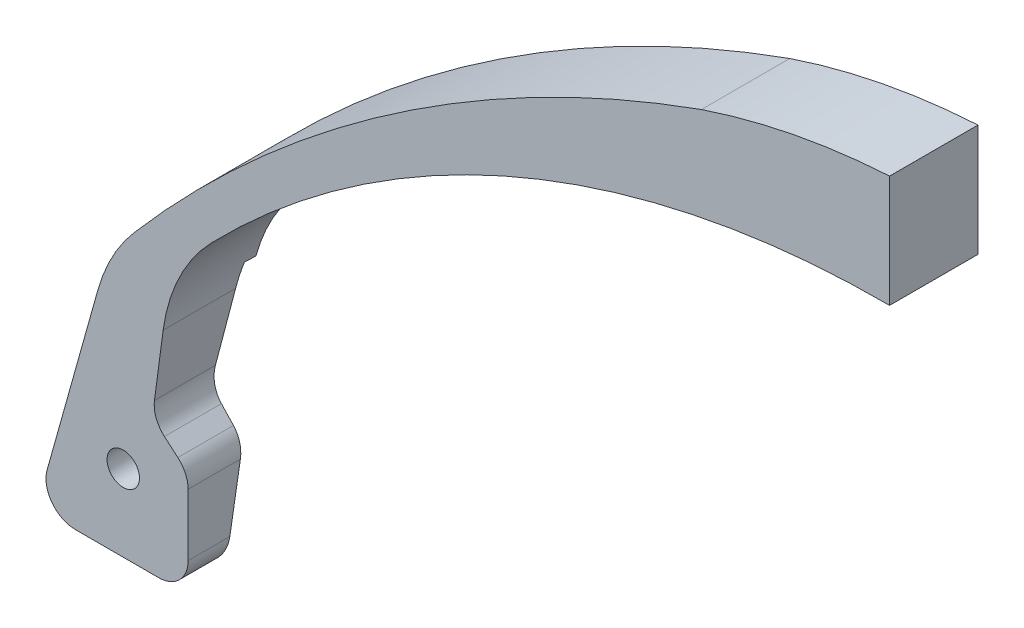
ISO-10303-21;
HEADER;
FILE_DESCRIPTION(('STEP AP214'),'2;1');
FILE_NAME('part.step','',(''),(''),'','','');
FILE_SCHEMA(('AUTOMOTIVE_DESIGN { 1 0 10303 214 1 1 1 1 }'));
ENDSEC;
DATA;
#1=APPLICATION_CONTEXT('core data for automotive mechanical design processes');
#2=APPLICATION_PROTOCOL_DEFINITION('international standard','automotive_design',2000,#1);
#3=PRODUCT_CONTEXT('',#1,'mechanical');
#4=PRODUCT('Part','Part','',(#3));
#5=PRODUCT_RELATED_PRODUCT_CATEGORY('part','',(#4));
#6=PRODUCT_DEFINITION_FORMATION('','',#4);
#7=PRODUCT_DEFINITION_CONTEXT('part definition',#1,'design');
#8=PRODUCT_DEFINITION('design','',#6,#7);
#9=PRODUCT_DEFINITION_SHAPE('','',#8);
#10=(LENGTH_UNIT() NAMED_UNIT(*) SI_UNIT(.MILLI.,.METRE.));
#11=(NAMED_UNIT(*) PLANE_ANGLE_UNIT() SI_UNIT($,.RADIAN.));
#12=(NAMED_UNIT(*) SI_UNIT($,.STERADIAN.) SOLID_ANGLE_UNIT());
#13=UNCERTAINTY_MEASURE_WITH_UNIT(LENGTH_MEASURE(1.E-05),#10,'distance_accuracy_value','');
#14=(GEOMETRIC_REPRESENTATION_CONTEXT(3) GLOBAL_UNCERTAINTY_ASSIGNED_CONTEXT((#13)) GLOBAL_UNIT_ASSIGNED_CONTEXT((#10,
#11,#12)) REPRESENTATION_CONTEXT('',''));
#15=CARTESIAN_POINT('',(0.,0.,0.));
#16=DIRECTION('',(0.,0.,1.));
#17=DIRECTION('',(1.,0.,0.));
#18=AXIS2_PLACEMENT_3D('',#15,#16,#17);
#19=CARTESIAN_POINT('',(-0.845059629265218,-70.0518343791008,15.));
#20=DIRECTION('',(0.,0.,1.));
#21=DIRECTION('',(1.,0.,0.));
#22=AXIS2_PLACEMENT_3D('',#19,#20,#21);
#23=PLANE('',#22);
#24=DIRECTION('',(-0.269681778757233,-0.962949499302188,0.));
#25=VECTOR('',#24,1.);
#26=CARTESIAN_POINT('',(-144.7,-13.,15.));
#27=LINE('',#26,#25);
#28=CARTESIAN_POINT('',(-134.294355961507,24.1553086120934,15.));
#29=VERTEX_POINT('',#28);
#30=CARTESIAN_POINT('',(-142.922076854503,-6.65159110621383,15.));
#31=VERTEX_POINT('',#30);
#32=EDGE_CURVE('E274',#29,#31,#27,.T.);
#33=ORIENTED_EDGE('',*,*,#32,.T.);
#34=CARTESIAN_POINT('',(-138.107329357992,-8.,15.));
#35=DIRECTION('',(0.,0.,1.));
#36=DIRECTION('',(1.,0.,0.));
#37=AXIS2_PLACEMENT_3D('',#34,#35,#36);
#38=CIRCLE('',#37,5.);
#39=CARTESIAN_POINT('',(-138.107329357992,-13.,15.));
#40=VERTEX_POINT('',#39);
#41=EDGE_CURVE('E11',#31,#40,#38,.T.);
#42=ORIENTED_EDGE('',*,*,#41,.T.);
#43=DIRECTION('',(1.,0.,0.));
#44=VECTOR('',#43,1.);
#45=CARTESIAN_POINT('',(-119.,-13.,15.));
#46=LINE('',#45,#44);
#47=CARTESIAN_POINT('',(-124.,-13.,15.));
#48=VERTEX_POINT('',#47);
#49=EDGE_CURVE('E255',#40,#48,#46,.T.);
#50=ORIENTED_EDGE('',*,*,#49,.T.);
#51=CARTESIAN_POINT('',(-124.,-8.,15.));
#52=DIRECTION('',(0.,0.,1.));
#53=DIRECTION('',(1.,0.,0.));
#54=AXIS2_PLACEMENT_3D('',#51,#52,#53);
#55=CIRCLE('',#54,5.);
#56=CARTESIAN_POINT('',(-119.,-8.,15.));
#57=VERTEX_POINT('',#56);
#58=EDGE_CURVE('E245',#48,#57,#55,.T.);
#59=ORIENTED_EDGE('',*,*,#58,.T.);
#60=DIRECTION('',(0.,1.,0.));
#61=VECTOR('',#60,1.);
#62=CARTESIAN_POINT('',(-119.,4.78233543889837,15.));
#63=LINE('',#62,#61);
#64=CARTESIAN_POINT('',(-119.,2.48831446117919,15.));
#65=VERTEX_POINT('',#64);
#66=EDGE_CURVE('E277',#57,#65,#63,.T.);
#67=ORIENTED_EDGE('',*,*,#66,.T.);
#68=CARTESIAN_POINT('',(-124.,2.48831446117919,15.));
#69=DIRECTION('',(0.,0.,1.));
#70=DIRECTION('',(1.,0.,0.));
#71=AXIS2_PLACEMENT_3D('',#68,#69,#70);
#72=CIRCLE('',#71,5.);
#73=CARTESIAN_POINT('',(-120.738959649311,6.278514433632,15.));
#74=VERTEX_POINT('',#73);
#75=EDGE_CURVE('E234',#65,#74,#72,.T.);
#76=ORIENTED_EDGE('',*,*,#75,.T.);
#77=DIRECTION('',(-0.758039994490562,0.652208070137704,0.));
#78=VECTOR('',#77,1.);
#79=CARTESIAN_POINT('',(-125.064319955924,10.,15.));
#80=LINE('',#79,#78);
#81=CARTESIAN_POINT('',(-123.011519403249,8.23379624219226,15.));
#82=VERTEX_POINT('',#81);
#83=EDGE_CURVE('E279',#74,#82,#80,.T.);
#84=ORIENTED_EDGE('',*,*,#83,.T.);
#85=CARTESIAN_POINT('',(-119.750479052561,12.0239962146451,15.));
#86=DIRECTION('',(0.,0.,1.));
#87=DIRECTION('',(1.,0.,0.));
#88=AXIS2_PLACEMENT_3D('',#85,#86,#87);
#89=CIRCLE('',#88,5.);
#90=CARTESIAN_POINT('',(-124.706684778162,12.6843179585853,15.));
#91=VERTEX_POINT('',#90);
#92=EDGE_CURVE('E223',#82,#91,#89,.F.);
#93=ORIENTED_EDGE('',*,*,#92,.T.);
#94=DIRECTION('',(0.132064348788054,0.991241145120191,0.));
#95=VECTOR('',#94,1.);
#96=CARTESIAN_POINT('',(-125.064319955924,10.,15.));
#97=LINE('',#96,#95);
#98=CARTESIAN_POINT('',(-123.232641548798,23.7481085427997,15.));
#99=VERTEX_POINT('',#98);
#100=EDGE_CURVE('E281',#91,#99,#97,.T.);
#101=ORIENTED_EDGE('',*,*,#100,.T.);
#102=CARTESIAN_POINT('',(-93.4954071951919,19.7861780791581,15.));
#103=DIRECTION('',(0.,0.,1.));
#104=DIRECTION('',(1.,0.,0.));
#105=AXIS2_PLACEMENT_3D('',#102,#103,#104);
#106=CIRCLE('',#105,30.);
#107=CARTESIAN_POINT('',(-115.032970686714,40.6699842180943,15.));
#108=VERTEX_POINT('',#107);
#109=EDGE_CURVE('E156',#99,#108,#106,.F.);
#110=ORIENTED_EDGE('',*,*,#109,.T.);
#111=CARTESIAN_POINT('',(-0.845059629265218,-70.0518343791008,15.));
#112=DIRECTION('',(0.,0.,-1.));
#113=DIRECTION('',(1.,0.,0.));
#114=AXIS2_PLACEMENT_3D('',#111,#112,#113);
#115=CIRCLE('',#114,159.054079309944);
#116=CARTESIAN_POINT('',(0.,89.,15.));
#117=VERTEX_POINT('',#116);
#118=EDGE_CURVE('E150',#108,#117,#115,.T.);
#119=ORIENTED_EDGE('',*,*,#118,.T.);
#120=DIRECTION('',(0.,1.,0.));
#121=VECTOR('',#120,1.);
#122=CARTESIAN_POINT('',(0.,108.,15.));
#123=LINE('',#122,#121);
#124=CARTESIAN_POINT('',(0.,108.,15.));
#125=VERTEX_POINT('',#124);
#126=EDGE_CURVE('E153',#117,#125,#123,.T.);
#127=ORIENTED_EDGE('',*,*,#126,.T.);
#128=CARTESIAN_POINT('',(7.06303295185343,-13.972703231893,15.));
#129=DIRECTION('',(0.,0.,1.));
#130=DIRECTION('',(-1.,0.,0.));
#131=AXIS2_PLACEMENT_3D('',#128,#129,#130);
#132=CIRCLE('',#131,122.177030444247);
#133=CARTESIAN_POINT('',(-31.918403877679,101.818809198335,15.));
#134=VERTEX_POINT('',#133);
#135=EDGE_CURVE('E170',#125,#134,#132,.T.);
#136=ORIENTED_EDGE('',*,*,#135,.T.);
#137=CARTESIAN_POINT('',(45.2497227622976,-113.42010972918,15.));
#138=DIRECTION('',(0.,0.,1.));
#139=DIRECTION('',(1.,0.,0.));
#140=AXIS2_PLACEMENT_3D('',#137,#138,#139);
#141=CIRCLE('',#140,228.65413180218);
#142=CARTESIAN_POINT('',(-128.157312250438,35.6191877674885,15.));
#143=VERTEX_POINT('',#142);
#144=EDGE_CURVE('E271',#134,#143,#141,.T.);
#145=ORIENTED_EDGE('',*,*,#144,.T.);
#146=CARTESIAN_POINT('',(-105.405870982442,16.0648552493764,15.));
#147=DIRECTION('',(0.,0.,1.));
#148=DIRECTION('',(1.,0.,0.));
#149=AXIS2_PLACEMENT_3D('',#146,#147,#148);
#150=CIRCLE('',#149,30.);
#151=EDGE_CURVE('E197',#143,#29,#150,.T.);
#152=ORIENTED_EDGE('',*,*,#151,.T.);
#153=EDGE_LOOP('',(#33,#42,#50,#59,#67,#76,#84,#93,#101,#110,#119,#127,#136,#145,#152));
#154=FACE_BOUND('',#153,.T.);
#155=CARTESIAN_POINT('',(-130.,0.,15.));
#156=DIRECTION('',(0.,0.,1.));
#157=DIRECTION('',(1.,0.,0.));
#158=AXIS2_PLACEMENT_3D('',#155,#156,#157);
#159=CIRCLE('',#158,2.75000000000001);
#160=CARTESIAN_POINT('',(-127.25,0.,15.));
#161=VERTEX_POINT('',#160);
#162=EDGE_CURVE('E261',#161,#161,#159,.T.);
#163=ORIENTED_EDGE('',*,*,#162,.F.);
#164=EDGE_LOOP('',(#163));
#165=FACE_BOUND('',#164,.T.);
#166=ADVANCED_FACE('F33',(#154,#165),#23,.T.);
#167=CARTESIAN_POINT('',(-0.845059629265218,-70.0518343791008,0.));
#168=DIRECTION('',(0.,0.,1.));
#169=DIRECTION('',(1.,0.,0.));
#170=AXIS2_PLACEMENT_3D('',#167,#168,#169);
#171=PLANE('',#170);
#172=DIRECTION('',(-0.962949499302188,0.269681778757233,0.));
#173=VECTOR('',#172,1.);
#174=CARTESIAN_POINT('',(-97.8981379810458,20.6241834333381,0.));
#175=LINE('',#174,#173);
#176=CARTESIAN_POINT('',(-122.48415135429,27.5096948997757,0.));
#177=VERTEX_POINT('',#176);
#178=CARTESIAN_POINT('',(-131.896112449928,30.1455905637797,0.));
#179=VERTEX_POINT('',#178);
#180=EDGE_CURVE('E188',#177,#179,#175,.T.);
#181=ORIENTED_EDGE('',*,*,#180,.T.);
#182=CARTESIAN_POINT('',(-105.405870982442,16.0648552493764,0.));
#183=DIRECTION('',(0.,0.,1.));
#184=DIRECTION('',(1.,0.,0.));
#185=AXIS2_PLACEMENT_3D('',#182,#183,#184);
#186=CIRCLE('',#185,30.);
#187=CARTESIAN_POINT('',(-128.157312250438,35.6191877674885,0.));
#188=VERTEX_POINT('',#187);
#189=EDGE_CURVE('E193',#179,#188,#186,.F.);
#190=ORIENTED_EDGE('',*,*,#189,.T.);
#191=CARTESIAN_POINT('',(45.2497227622976,-113.42010972918,0.));
#192=DIRECTION('',(0.,0.,1.));
#193=DIRECTION('',(1.,0.,0.));
#194=AXIS2_PLACEMENT_3D('',#191,#192,#193);
#195=CIRCLE('',#194,228.65413180218);
#196=CARTESIAN_POINT('',(-31.918403877679,101.818809198335,0.));
#197=VERTEX_POINT('',#196);
#198=EDGE_CURVE('E161',#197,#188,#195,.T.);
#199=ORIENTED_EDGE('',*,*,#198,.F.);
#200=CARTESIAN_POINT('',(7.06303295185343,-13.972703231893,0.));
#201=DIRECTION('',(0.,0.,1.));
#202=DIRECTION('',(-1.,0.,0.));
#203=AXIS2_PLACEMENT_3D('',#200,#201,#202);
#204=CIRCLE('',#203,122.177030444247);
#205=CARTESIAN_POINT('',(0.,108.,0.));
#206=VERTEX_POINT('',#205);
#207=EDGE_CURVE('E286',#206,#197,#204,.T.);
#208=ORIENTED_EDGE('',*,*,#207,.F.);
#209=DIRECTION('',(0.,1.,0.));
#210=VECTOR('',#209,1.);
#211=CARTESIAN_POINT('',(0.,108.,0.));
#212=LINE('',#211,#210);
#213=CARTESIAN_POINT('',(0.,89.,0.));
#214=VERTEX_POINT('',#213);
#215=EDGE_CURVE('E284',#214,#206,#212,.T.);
#216=ORIENTED_EDGE('',*,*,#215,.F.);
#217=CARTESIAN_POINT('',(-0.845059629265218,-70.0518343791008,0.));
#218=DIRECTION('',(0.,0.,-1.));
#219=DIRECTION('',(1.,0.,0.));
#220=AXIS2_PLACEMENT_3D('',#217,#218,#219);
#221=CIRCLE('',#220,159.054079309944);
#222=CARTESIAN_POINT('',(-115.032970686714,40.6699842180943,0.));
#223=VERTEX_POINT('',#222);
#224=EDGE_CURVE('E174',#223,#214,#221,.T.);
#225=ORIENTED_EDGE('',*,*,#224,.F.);
#226=CARTESIAN_POINT('',(-93.4954071951919,19.7861780791581,0.));
#227=DIRECTION('',(0.,0.,1.));
#228=DIRECTION('',(1.,0.,0.));
#229=AXIS2_PLACEMENT_3D('',#226,#227,#228);
#230=CIRCLE('',#229,30.);
#231=EDGE_CURVE('E204',#223,#177,#230,.T.);
#232=ORIENTED_EDGE('',*,*,#231,.T.);
#233=EDGE_LOOP('',(#181,#190,#199,#208,#216,#225,#232));
#234=FACE_BOUND('',#233,.T.);
#235=ADVANCED_FACE('F300',(#234),#171,.F.);
#236=CARTESIAN_POINT('',(-0.845059629265218,-70.0518343791008,15.));
#237=DIRECTION('',(0.,0.,-1.));
#238=DIRECTION('',(-1.,0.,0.));
#239=AXIS2_PLACEMENT_3D('',#236,#237,#238);
#240=CYLINDRICAL_SURFACE('',#239,159.054079309944);
#241=ORIENTED_EDGE('',*,*,#118,.F.);
#242=DIRECTION('',(0.,0.,-1.));
#243=VECTOR('',#242,1.);
#244=CARTESIAN_POINT('',(-115.032970686714,40.6699842180943,15.));
#245=LINE('',#244,#243);
#246=EDGE_CURVE('E199',#108,#223,#245,.T.);
#247=ORIENTED_EDGE('',*,*,#246,.T.);
#248=ORIENTED_EDGE('',*,*,#224,.T.);
#249=DIRECTION('',(0.,0.,-1.));
#250=VECTOR('',#249,1.);
#251=CARTESIAN_POINT('',(0.,89.,15.));
#252=LINE('',#251,#250);
#253=EDGE_CURVE('E166',#117,#214,#252,.T.);
#254=ORIENTED_EDGE('',*,*,#253,.F.);
#255=EDGE_LOOP('',(#241,#247,#248,#254));
#256=FACE_BOUND('',#255,.T.);
#257=ADVANCED_FACE('F172',(#256),#240,.F.);
#258=CARTESIAN_POINT('',(0.,108.,15.));
#259=DIRECTION('',(-1.,0.,0.));
#260=DIRECTION('',(0.,0.,1.));
#261=AXIS2_PLACEMENT_3D('',#258,#259,#260);
#262=PLANE('',#261);
#263=ORIENTED_EDGE('',*,*,#215,.T.);
#264=DIRECTION('',(0.,0.,-1.));
#265=VECTOR('',#264,1.);
#266=CARTESIAN_POINT('',(0.,108.,15.));
#267=LINE('',#266,#265);
#268=EDGE_CURVE('E168',#125,#206,#267,.T.);
#269=ORIENTED_EDGE('',*,*,#268,.F.);
#270=ORIENTED_EDGE('',*,*,#126,.F.);
#271=ORIENTED_EDGE('',*,*,#253,.T.);
#272=EDGE_LOOP('',(#263,#269,#270,#271));
#273=FACE_BOUND('',#272,.T.);
#274=ADVANCED_FACE('F165',(#273),#262,.F.);
#275=CARTESIAN_POINT('',(7.06303295185343,-13.972703231893,15.));
#276=DIRECTION('',(0.,0.,-1.));
#277=DIRECTION('',(-1.,0.,0.));
#278=AXIS2_PLACEMENT_3D('',#275,#276,#277);
#279=CYLINDRICAL_SURFACE('',#278,122.177030444247);
#280=ORIENTED_EDGE('',*,*,#207,.T.);
#281=DIRECTION('',(0.,0.,-1.));
#282=VECTOR('',#281,1.);
#283=CARTESIAN_POINT('',(-31.918403877679,101.818809198335,15.));
#284=LINE('',#283,#282);
#285=EDGE_CURVE('E181',#134,#197,#284,.T.);
#286=ORIENTED_EDGE('',*,*,#285,.F.);
#287=ORIENTED_EDGE('',*,*,#135,.F.);
#288=ORIENTED_EDGE('',*,*,#268,.T.);
#289=EDGE_LOOP('',(#280,#286,#287,#288));
#290=FACE_BOUND('',#289,.T.);
#291=ADVANCED_FACE('F308',(#290),#279,.T.);
#292=CARTESIAN_POINT('',(45.2497227622976,-113.42010972918,15.));
#293=DIRECTION('',(0.,0.,-1.));
#294=DIRECTION('',(-1.,0.,0.));
#295=AXIS2_PLACEMENT_3D('',#292,#293,#294);
#296=CYLINDRICAL_SURFACE('',#295,228.65413180218);
#297=ORIENTED_EDGE('',*,*,#198,.T.);
#298=DIRECTION('',(0.,0.,-1.));
#299=VECTOR('',#298,1.);
#300=CARTESIAN_POINT('',(-128.157312250438,35.6191877674886,15.));
#301=LINE('',#300,#299);
#302=EDGE_CURVE('E195',#188,#143,#301,.F.);
#303=ORIENTED_EDGE('',*,*,#302,.T.);
#304=ORIENTED_EDGE('',*,*,#144,.F.);
#305=ORIENTED_EDGE('',*,*,#285,.T.);
#306=EDGE_LOOP('',(#297,#303,#304,#305));
#307=FACE_BOUND('',#306,.T.);
#308=ADVANCED_FACE('F294',(#307),#296,.T.);
#309=CARTESIAN_POINT('',(-144.7,-13.,15.));
#310=DIRECTION('',(0.962949499302188,-0.269681778757233,0.));
#311=DIRECTION('',(0.269681778757233,0.962949499302188,0.));
#312=AXIS2_PLACEMENT_3D('',#309,#310,#311);
#313=PLANE('',#312);
#314=DIRECTION('',(0.265540688207384,0.948162956844932,-0.174571332622009));
#315=VECTOR('',#314,1.);
#316=CARTESIAN_POINT('',(-144.7,-13.,10.));
#317=LINE('',#316,#315);
#318=CARTESIAN_POINT('',(-142.922076854503,-6.65159110621381,8.83116062210927));
#319=VERTEX_POINT('',#318);
#320=CARTESIAN_POINT('',(-134.294355961507,24.1553086120934,3.15913821398535));
#321=VERTEX_POINT('',#320);
#322=EDGE_CURVE('E345',#319,#321,#317,.T.);
#323=ORIENTED_EDGE('',*,*,#322,.F.);
#324=DIRECTION('',(0.,0.,-1.));
#325=VECTOR('',#324,1.);
#326=CARTESIAN_POINT('',(-142.922076854503,-6.65159110621383,15.));
#327=LINE('',#326,#325);
#328=EDGE_CURVE('E41',#319,#31,#327,.F.);
#329=ORIENTED_EDGE('',*,*,#328,.T.);
#330=ORIENTED_EDGE('',*,*,#32,.F.);
#331=DIRECTION('',(0.,0.,-1.));
#332=VECTOR('',#331,1.);
#333=CARTESIAN_POINT('',(-134.294355961507,24.1553086120934,15.));
#334=LINE('',#333,#332);
#335=EDGE_CURVE('E176',#29,#321,#334,.T.);
#336=ORIENTED_EDGE('',*,*,#335,.T.);
#337=EDGE_LOOP('',(#323,#329,#330,#336));
#338=FACE_BOUND('',#337,.T.);
#339=ADVANCED_FACE('F315',(#338),#313,.F.);
#340=CARTESIAN_POINT('',(-119.,-13.,15.));
#341=DIRECTION('',(0.,1.,0.));
#342=DIRECTION('',(-1.,0.,0.));
#343=AXIS2_PLACEMENT_3D('',#340,#341,#342);
#344=PLANE('',#343);
#345=ORIENTED_EDGE('',*,*,#49,.F.);
#346=DIRECTION('',(0.,0.,-1.));
#347=VECTOR('',#346,1.);
#348=CARTESIAN_POINT('',(-138.107329357992,-13.,15.));
#349=LINE('',#348,#347);
#350=CARTESIAN_POINT('',(-138.107329357992,-13.,9.68478531748893));
#351=VERTEX_POINT('',#350);
#352=EDGE_CURVE('E247',#40,#351,#349,.T.);
#353=ORIENTED_EDGE('',*,*,#352,.T.);
#354=DIRECTION('',(0.998858919511933,0.,-0.0477583386588517));
#355=VECTOR('',#354,1.);
#356=CARTESIAN_POINT('',(-119.297137286777,-13.,8.7854155410103));
#357=LINE('',#356,#355);
#358=CARTESIAN_POINT('',(-124.,-13.,9.01027303162965));
#359=VERTEX_POINT('',#358);
#360=EDGE_CURVE('E254',#351,#359,#357,.T.);
#361=ORIENTED_EDGE('',*,*,#360,.T.);
#362=DIRECTION('',(0.,0.,-1.));
#363=VECTOR('',#362,1.);
#364=CARTESIAN_POINT('',(-124.,-13.,15.));
#365=LINE('',#364,#363);
#366=EDGE_CURVE('E242',#359,#48,#365,.F.);
#367=ORIENTED_EDGE('',*,*,#366,.T.);
#368=EDGE_LOOP('',(#345,#353,#361,#367));
#369=FACE_BOUND('',#368,.T.);
#370=ADVANCED_FACE('F253',(#369),#344,.F.);
#371=CARTESIAN_POINT('',(-119.,4.78233543889837,15.));
#372=DIRECTION('',(-1.,0.,0.));
#373=DIRECTION('',(0.,0.,1.));
#374=AXIS2_PLACEMENT_3D('',#371,#372,#373);
#375=PLANE('',#374);
#376=ORIENTED_EDGE('',*,*,#66,.F.);
#377=DIRECTION('',(0.,0.,-1.));
#378=VECTOR('',#377,1.);
#379=CARTESIAN_POINT('',(-119.,-8.,15.));
#380=LINE('',#379,#378);
#381=CARTESIAN_POINT('',(-119.,-8.,7.91758385113638));
#382=VERTEX_POINT('',#381);
#383=EDGE_CURVE('E236',#57,#382,#380,.T.);
#384=ORIENTED_EDGE('',*,*,#383,.T.);
#385=DIRECTION('',(0.,0.985737532298671,-0.16828998014655));
#386=VECTOR('',#385,1.);
#387=CARTESIAN_POINT('',(-119.,3.24542006063508,5.99771019640119));
#388=LINE('',#387,#386);
#389=CARTESIAN_POINT('',(-119.,2.48831446117919,6.12696700374234));
#390=VERTEX_POINT('',#389);
#391=EDGE_CURVE('E262',#382,#390,#388,.T.);
#392=ORIENTED_EDGE('',*,*,#391,.T.);
#393=DIRECTION('',(0.,0.,-1.));
#394=VECTOR('',#393,1.);
#395=CARTESIAN_POINT('',(-119.,2.48831446117919,15.));
#396=LINE('',#395,#394);
#397=EDGE_CURVE('E231',#390,#65,#396,.F.);
#398=ORIENTED_EDGE('',*,*,#397,.T.);
#399=EDGE_LOOP('',(#376,#384,#392,#398));
#400=FACE_BOUND('',#399,.T.);
#401=ADVANCED_FACE('F335',(#400),#375,.F.);
#402=CARTESIAN_POINT('',(-125.064319955924,10.,15.));
#403=DIRECTION('',(-0.652208070137704,-0.758039994490562,0.));
#404=DIRECTION('',(0.758039994490562,-0.652208070137704,0.));
#405=AXIS2_PLACEMENT_3D('',#402,#403,#404);
#406=PLANE('',#405);
#407=ORIENTED_EDGE('',*,*,#83,.F.);
#408=DIRECTION('',(0.,0.,-1.));
#409=VECTOR('',#408,1.);
#410=CARTESIAN_POINT('',(-120.738959649311,6.278514433632,15.));
#411=LINE('',#410,#409);
#412=CARTESIAN_POINT('',(-120.738959649311,6.278514433632,5.56303004299894));
#413=VERTEX_POINT('',#412);
#414=EDGE_CURVE('E225',#74,#413,#411,.T.);
#415=ORIENTED_EDGE('',*,*,#414,.T.);
#416=DIRECTION('',(-0.755911086850826,0.650376384800117,-0.0748931697174921));
#417=VECTOR('',#416,1.);
#418=CARTESIAN_POINT('',(-124.505807875409,9.51946323567463,5.18982318255662));
#419=LINE('',#418,#417);
#420=CARTESIAN_POINT('',(-123.011519403249,8.23379624219226,5.33787234084923));
#421=VERTEX_POINT('',#420);
#422=EDGE_CURVE('E266',#413,#421,#419,.T.);
#423=ORIENTED_EDGE('',*,*,#422,.T.);
#424=DIRECTION('',(0.,0.,-1.));
#425=VECTOR('',#424,1.);
#426=CARTESIAN_POINT('',(-123.011519403249,8.23379624219226,15.));
#427=LINE('',#426,#425);
#428=EDGE_CURVE('E217',#421,#82,#427,.F.);
#429=ORIENTED_EDGE('',*,*,#428,.T.);
#430=EDGE_LOOP('',(#407,#415,#423,#429));
#431=FACE_BOUND('',#430,.T.);
#432=ADVANCED_FACE('F331',(#431),#406,.F.);
#433=CARTESIAN_POINT('',(-125.064319955924,10.,15.));
#434=DIRECTION('',(-0.991241145120191,0.132064348788054,0.));
#435=DIRECTION('',(-0.132064348788054,-0.991241145120191,0.));
#436=AXIS2_PLACEMENT_3D('',#433,#434,#435);
#437=PLANE('',#436);
#438=ORIENTED_EDGE('',*,*,#100,.F.);
#439=DIRECTION('',(0.,0.,-1.));
#440=VECTOR('',#439,1.);
#441=CARTESIAN_POINT('',(-124.706684778162,12.6843179585853,5.13448765333506));
#442=LINE('',#441,#440);
#443=CARTESIAN_POINT('',(-124.706684778162,12.6843179585853,4.65910805946909));
#444=VERTEX_POINT('',#443);
#445=EDGE_CURVE('E214',#91,#444,#442,.T.);
#446=ORIENTED_EDGE('',*,*,#445,.T.);
#447=DIRECTION('',(0.130075374667799,0.976312415280016,-0.17290015811194));
#448=VECTOR('',#447,1.);
#449=CARTESIAN_POINT('',(-125.286195849959,8.33465642093615,5.42941186368453));
#450=LINE('',#449,#448);
#451=CARTESIAN_POINT('',(-123.232641548798,23.7481085427997,2.69976480889759));
#452=VERTEX_POINT('',#451);
#453=EDGE_CURVE('E187',#444,#452,#450,.T.);
#454=ORIENTED_EDGE('',*,*,#453,.T.);
#455=DIRECTION('',(0.,0.,1.));
#456=VECTOR('',#455,1.);
#457=CARTESIAN_POINT('',(-123.232641548798,23.7481085427997,15.));
#458=LINE('',#457,#456);
#459=EDGE_CURVE('E201',#452,#99,#458,.T.);
#460=ORIENTED_EDGE('',*,*,#459,.T.);
#461=EDGE_LOOP('',(#438,#446,#454,#460));
#462=FACE_BOUND('',#461,.T.);
#463=ADVANCED_FACE('F328',(#462),#437,.F.);
#464=CARTESIAN_POINT('',(-130.,0.,15.));
#465=DIRECTION('',(0.,0.,-1.));
#466=DIRECTION('',(-1.,0.,0.));
#467=AXIS2_PLACEMENT_3D('',#464,#465,#466);
#468=CYLINDRICAL_SURFACE('',#467,2.75000000000001);
#469=CARTESIAN_POINT('',(-130.,0.,7.07772620577887));
#470=DIRECTION('',(0.0470787075015239,0.168103377340879,0.984644529678897));
#471=DIRECTION('',(0.265540688207384,0.948162956844932,-0.174571332622009));
#472=AXIS2_PLACEMENT_3D('',#469,#470,#471);
#473=ELLIPSE('',#472,2.79288607930094,2.75000000000001);
#474=CARTESIAN_POINT('',(-129.258375108418,2.64811112308101,6.59016836105385));
#475=VERTEX_POINT('',#474);
#476=EDGE_CURVE('E185',#475,#475,#473,.T.);
#477=ORIENTED_EDGE('',*,*,#476,.F.);
#478=EDGE_LOOP('',(#477));
#479=FACE_BOUND('',#478,.T.);
#480=ORIENTED_EDGE('',*,*,#162,.T.);
#481=EDGE_LOOP('',(#480));
#482=FACE_BOUND('',#481,.T.);
#483=ADVANCED_FACE('F325',(#479,#482),#468,.F.);
#484=CARTESIAN_POINT('',(-97.8650072945601,20.7424827789965,1.99999999999999));
#485=DIRECTION('',(0.269174446562269,0.961137974306426,-0.0613099638234802));
#486=DIRECTION('',(-0.962949499302188,0.269681778757233,0.));
#487=AXIS2_PLACEMENT_3D('',#484,#485,#486);
#488=PLANE('',#487);
#489=DIRECTION('',(-0.962949499302188,0.269681778757233,0.));
#490=VECTOR('',#489,1.);
#491=CARTESIAN_POINT('',(-97.8650072945601,20.7424827789965,1.99999999999999));
#492=LINE('',#491,#490);
#493=CARTESIAN_POINT('',(-122.452278476177,27.6283465048201,1.99999999999999));
#494=VERTEX_POINT('',#493);
#495=CARTESIAN_POINT('',(-131.836825959697,30.2565647655092,1.99999999999999));
#496=VERTEX_POINT('',#495);
#497=EDGE_CURVE('E346',#494,#496,#492,.T.);
#498=ORIENTED_EDGE('',*,*,#497,.T.);
#499=CARTESIAN_POINT('',(-105.405870982442,16.0648552493764,-104.437075659583));
#500=DIRECTION('',(0.269174446562269,0.961137974306426,-0.0613099638234802));
#501=DIRECTION('',(-0.0165341800994577,-0.0590383989660555,-0.998118774663599));
#502=AXIS2_PLACEMENT_3D('',#499,#500,#501);
#503=ELLIPSE('',#502,489.316876558174,30.);
#504=EDGE_CURVE('E191',#496,#179,#503,.F.);
#505=ORIENTED_EDGE('',*,*,#504,.T.);
#506=ORIENTED_EDGE('',*,*,#180,.F.);
#507=CARTESIAN_POINT('',(-93.4954071951919,19.7861780791581,6.1925310405249));
#508=DIRECTION('',(0.269174446562269,0.961137974306426,-0.0613099638234802));
#509=DIRECTION('',(-0.0165341800994577,-0.0590383989660555,-0.998118774663599));
#510=AXIS2_PLACEMENT_3D('',#507,#508,#509);
#511=ELLIPSE('',#510,489.316876558174,30.);
#512=EDGE_CURVE('E207',#177,#494,#511,.T.);
#513=ORIENTED_EDGE('',*,*,#512,.T.);
#514=EDGE_LOOP('',(#498,#505,#506,#513));
#515=FACE_BOUND('',#514,.T.);
#516=ADVANCED_FACE('F350',(#515),#488,.F.);
#517=CARTESIAN_POINT('',(-110.033818025121,-22.7085440352604,10.));
#518=DIRECTION('',(0.0470787075015239,0.168103377340879,0.984644529678897));
#519=DIRECTION('',(0.,-0.985737532298671,0.16828998014655));
#520=AXIS2_PLACEMENT_3D('',#517,#518,#519);
#521=PLANE('',#520);
#522=ORIENTED_EDGE('',*,*,#476,.T.);
#523=EDGE_LOOP('',(#522));
#524=FACE_BOUND('',#523,.T.);
#525=ORIENTED_EDGE('',*,*,#360,.F.);
#526=CARTESIAN_POINT('',(-138.107329357992,-8.,8.83116062210927));
#527=DIRECTION('',(0.0470787075015239,0.168103377340879,0.984644529678897));
#528=DIRECTION('',(0.265540688207384,0.948162956844932,-0.174571332622009));
#529=AXIS2_PLACEMENT_3D('',#526,#527,#528);
#530=ELLIPSE('',#529,5.07797468963805,5.);
#531=EDGE_CURVE('E55',#351,#319,#530,.F.);
#532=ORIENTED_EDGE('',*,*,#531,.T.);
#533=ORIENTED_EDGE('',*,*,#322,.T.);
#534=CARTESIAN_POINT('',(-105.405870982442,16.0648552493764,3.15913821398536));
#535=DIRECTION('',(0.0470787075015239,0.168103377340879,0.984644529678897));
#536=DIRECTION('',(0.265540688207384,0.948162956844932,-0.174571332622009));
#537=AXIS2_PLACEMENT_3D('',#534,#535,#536);
#538=ELLIPSE('',#537,30.4678481378283,30.);
#539=EDGE_CURVE('E179',#321,#496,#538,.F.);
#540=ORIENTED_EDGE('',*,*,#539,.T.);
#541=ORIENTED_EDGE('',*,*,#497,.F.);
#542=CARTESIAN_POINT('',(-93.4954071951919,19.7861780791581,1.95434182203638));
#543=DIRECTION('',(0.0470787075015239,0.168103377340879,0.984644529678897));
#544=DIRECTION('',(0.265540688207384,0.948162956844932,-0.174571332622009));
#545=AXIS2_PLACEMENT_3D('',#542,#543,#544);
#546=ELLIPSE('',#545,30.4678481378283,30.);
#547=EDGE_CURVE('E210',#494,#452,#546,.T.);
#548=ORIENTED_EDGE('',*,*,#547,.T.);
#549=ORIENTED_EDGE('',*,*,#453,.F.);
#550=CARTESIAN_POINT('',(-119.750479052561,12.0239962146451,4.53487089499222));
#551=DIRECTION('',(0.0470787075015239,0.168103377340879,0.984644529678897));
#552=DIRECTION('',(-0.265540688207384,-0.948162956844932,0.174571332622009));
#553=AXIS2_PLACEMENT_3D('',#550,#551,#552);
#554=ELLIPSE('',#553,5.07797468963805,5.);
#555=EDGE_CURVE('E220',#444,#421,#554,.T.);
#556=ORIENTED_EDGE('',*,*,#555,.T.);
#557=ORIENTED_EDGE('',*,*,#422,.F.);
#558=CARTESIAN_POINT('',(-124.,2.48831446117919,6.36603148885596));
#559=DIRECTION('',(0.0470787075015239,0.168103377340879,0.984644529678897));
#560=DIRECTION('',(0.265540688207384,0.948162956844932,-0.174571332622009));
#561=AXIS2_PLACEMENT_3D('',#558,#559,#560);
#562=ELLIPSE('',#561,5.07797468963805,5.);
#563=EDGE_CURVE('E228',#413,#390,#562,.F.);
#564=ORIENTED_EDGE('',*,*,#563,.T.);
#565=ORIENTED_EDGE('',*,*,#391,.F.);
#566=CARTESIAN_POINT('',(-124.,-8.,8.15664833624999));
#567=DIRECTION('',(0.0470787075015239,0.168103377340879,0.984644529678897));
#568=DIRECTION('',(0.265540688207384,0.948162956844932,-0.174571332622009));
#569=AXIS2_PLACEMENT_3D('',#566,#567,#568);
#570=ELLIPSE('',#569,5.07797468963805,5.);
#571=EDGE_CURVE('E239',#382,#359,#570,.F.);
#572=ORIENTED_EDGE('',*,*,#571,.T.);
#573=EDGE_LOOP('',(#525,#532,#533,#540,#541,#548,#549,#556,#557,#564,#565,#572));
#574=FACE_BOUND('',#573,.T.);
#575=ADVANCED_FACE('F258',(#524,#574),#521,.F.);
#576=CARTESIAN_POINT('',(-105.405870982442,16.0648552493764,15.));
#577=DIRECTION('',(0.,0.,-1.));
#578=DIRECTION('',(-1.,0.,0.));
#579=AXIS2_PLACEMENT_3D('',#576,#577,#578);
#580=CYLINDRICAL_SURFACE('',#579,30.);
#581=ORIENTED_EDGE('',*,*,#151,.F.);
#582=ORIENTED_EDGE('',*,*,#302,.F.);
#583=ORIENTED_EDGE('',*,*,#189,.F.);
#584=ORIENTED_EDGE('',*,*,#504,.F.);
#585=ORIENTED_EDGE('',*,*,#539,.F.);
#586=ORIENTED_EDGE('',*,*,#335,.F.);
#587=EDGE_LOOP('',(#581,#582,#583,#584,#585,#586));
#588=FACE_BOUND('',#587,.T.);
#589=ADVANCED_FACE('F305',(#588),#580,.T.);
#590=CARTESIAN_POINT('',(-93.4954071951919,19.7861780791581,15.));
#591=DIRECTION('',(0.,0.,-1.));
#592=DIRECTION('',(-1.,0.,0.));
#593=AXIS2_PLACEMENT_3D('',#590,#591,#592);
#594=CYLINDRICAL_SURFACE('',#593,30.);
#595=ORIENTED_EDGE('',*,*,#109,.F.);
#596=ORIENTED_EDGE('',*,*,#459,.F.);
#597=ORIENTED_EDGE('',*,*,#547,.F.);
#598=ORIENTED_EDGE('',*,*,#512,.F.);
#599=ORIENTED_EDGE('',*,*,#231,.F.);
#600=ORIENTED_EDGE('',*,*,#246,.F.);
#601=EDGE_LOOP('',(#595,#596,#597,#598,#599,#600));
#602=FACE_BOUND('',#601,.T.);
#603=ADVANCED_FACE('F368',(#602),#594,.F.);
#604=CARTESIAN_POINT('',(-119.750479052561,12.0239962146451,15.));
#605=DIRECTION('',(0.,0.,1.));
#606=DIRECTION('',(1.,0.,0.));
#607=AXIS2_PLACEMENT_3D('',#604,#605,#606);
#608=CYLINDRICAL_SURFACE('',#607,5.);
#609=ORIENTED_EDGE('',*,*,#92,.F.);
#610=ORIENTED_EDGE('',*,*,#428,.F.);
#611=ORIENTED_EDGE('',*,*,#555,.F.);
#612=ORIENTED_EDGE('',*,*,#445,.F.);
#613=EDGE_LOOP('',(#609,#610,#611,#612));
#614=FACE_BOUND('',#613,.T.);
#615=ADVANCED_FACE('F364',(#614),#608,.F.);
#616=CARTESIAN_POINT('',(-124.,2.48831446117919,15.));
#617=DIRECTION('',(0.,0.,-1.));
#618=DIRECTION('',(-1.,0.,0.));
#619=AXIS2_PLACEMENT_3D('',#616,#617,#618);
#620=CYLINDRICAL_SURFACE('',#619,5.);
#621=ORIENTED_EDGE('',*,*,#75,.F.);
#622=ORIENTED_EDGE('',*,*,#397,.F.);
#623=ORIENTED_EDGE('',*,*,#563,.F.);
#624=ORIENTED_EDGE('',*,*,#414,.F.);
#625=EDGE_LOOP('',(#621,#622,#623,#624));
#626=FACE_BOUND('',#625,.T.);
#627=ADVANCED_FACE('F375',(#626),#620,.T.);
#628=CARTESIAN_POINT('',(-124.,-8.,15.));
#629=DIRECTION('',(0.,0.,-1.));
#630=DIRECTION('',(-1.,0.,0.));
#631=AXIS2_PLACEMENT_3D('',#628,#629,#630);
#632=CYLINDRICAL_SURFACE('',#631,5.);
#633=ORIENTED_EDGE('',*,*,#58,.F.);
#634=ORIENTED_EDGE('',*,*,#366,.F.);
#635=ORIENTED_EDGE('',*,*,#571,.F.);
#636=ORIENTED_EDGE('',*,*,#383,.F.);
#637=EDGE_LOOP('',(#633,#634,#635,#636));
#638=FACE_BOUND('',#637,.T.);
#639=ADVANCED_FACE('F381',(#638),#632,.T.);
#640=CARTESIAN_POINT('',(-138.107329357992,-8.,15.));
#641=DIRECTION('',(0.,0.,-1.));
#642=DIRECTION('',(-1.,0.,0.));
#643=AXIS2_PLACEMENT_3D('',#640,#641,#642);
#644=CYLINDRICAL_SURFACE('',#643,5.);
#645=ORIENTED_EDGE('',*,*,#41,.F.);
#646=ORIENTED_EDGE('',*,*,#328,.F.);
#647=ORIENTED_EDGE('',*,*,#531,.F.);
#648=ORIENTED_EDGE('',*,*,#352,.F.);
#649=EDGE_LOOP('',(#645,#646,#647,#648));
#650=FACE_BOUND('',#649,.T.);
#651=ADVANCED_FACE('F35',(#650),#644,.T.);
#652=CLOSED_SHELL('',(#166,#235,#257,#274,#291,#308,#339,#370,#401,#432,#463,#483,#516,#575,
#589,#603,#615,#627,#639,#651));
#653=MANIFOLD_SOLID_BREP('B2',#652);
#654=ADVANCED_BREP_SHAPE_REPRESENTATION('',(#18,#653),#14);
#655=SHAPE_DEFINITION_REPRESENTATION(#9,#654);
ENDSEC;
END-ISO-10303-21;
